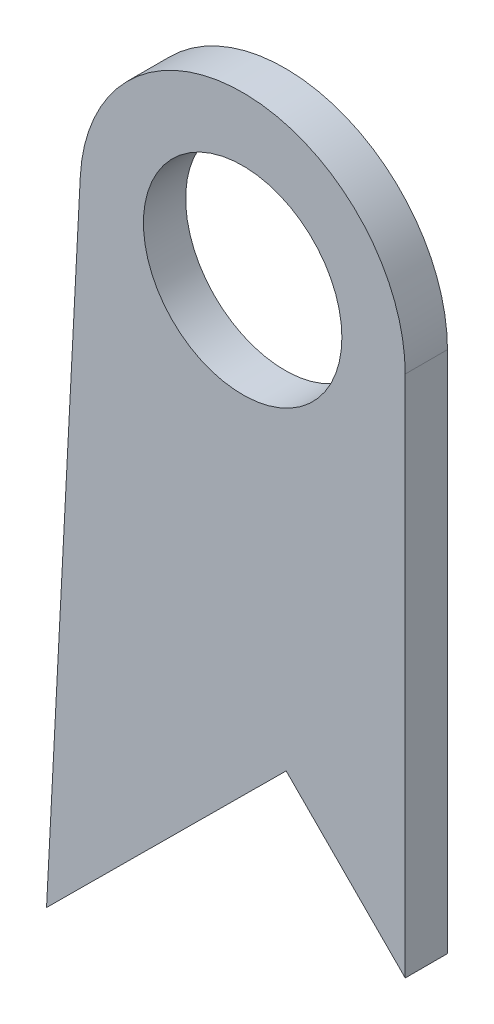
ISO-10303-21;
HEADER;
FILE_DESCRIPTION(('STEP AP214'),'2;1');
FILE_NAME('part.step','',(''),(''),'','','');
FILE_SCHEMA(('AUTOMOTIVE_DESIGN { 1 0 10303 214 1 1 1 1 }'));
ENDSEC;
DATA;
#1=APPLICATION_CONTEXT('core data for automotive mechanical design processes');
#2=APPLICATION_PROTOCOL_DEFINITION('international standard','automotive_design',2000,#1);
#3=PRODUCT_CONTEXT('',#1,'mechanical');
#4=PRODUCT('Part','Part','',(#3));
#5=PRODUCT_RELATED_PRODUCT_CATEGORY('part','',(#4));
#6=PRODUCT_DEFINITION_FORMATION('','',#4);
#7=PRODUCT_DEFINITION_CONTEXT('part definition',#1,'design');
#8=PRODUCT_DEFINITION('design','',#6,#7);
#9=PRODUCT_DEFINITION_SHAPE('','',#8);
#10=(LENGTH_UNIT() NAMED_UNIT(*) SI_UNIT(.MILLI.,.METRE.));
#11=(NAMED_UNIT(*) PLANE_ANGLE_UNIT() SI_UNIT($,.RADIAN.));
#12=(NAMED_UNIT(*) SI_UNIT($,.STERADIAN.) SOLID_ANGLE_UNIT());
#13=UNCERTAINTY_MEASURE_WITH_UNIT(LENGTH_MEASURE(1.E-05),#10,'distance_accuracy_value','');
#14=(GEOMETRIC_REPRESENTATION_CONTEXT(3) GLOBAL_UNCERTAINTY_ASSIGNED_CONTEXT((#13)) GLOBAL_UNIT_ASSIGNED_CONTEXT((#10,
#11,#12)) REPRESENTATION_CONTEXT('',''));
#15=CARTESIAN_POINT('',(0.,0.,0.));
#16=DIRECTION('',(0.,0.,1.));
#17=DIRECTION('',(1.,0.,0.));
#18=AXIS2_PLACEMENT_3D('',#15,#16,#17);
#19=CARTESIAN_POINT('',(0.,0.,10.));
#20=DIRECTION('',(0.,0.,-1.));
#21=DIRECTION('',(-1.,0.,0.));
#22=AXIS2_PLACEMENT_3D('',#19,#20,#21);
#23=PLANE('',#22);
#24=CARTESIAN_POINT('',(0.,0.,10.));
#25=DIRECTION('',(0.,0.,1.));
#26=DIRECTION('',(-1.,0.,0.));
#27=AXIS2_PLACEMENT_3D('',#24,#25,#26);
#28=CIRCLE('',#27,38.5);
#29=CARTESIAN_POINT('',(38.5,0.,10.));
#30=VERTEX_POINT('',#29);
#31=CARTESIAN_POINT('',(-38.4481594783973,1.99725629895806,10.));
#32=VERTEX_POINT('',#31);
#33=EDGE_CURVE('E117',#30,#32,#28,.T.);
#34=ORIENTED_EDGE('',*,*,#33,.T.);
#35=DIRECTION('',(-0.0518767869859238,-0.998653492945385,0.));
#36=VECTOR('',#35,1.);
#37=CARTESIAN_POINT('',(-46.4416889370996,-151.882090875355,10.));
#38=LINE('',#37,#36);
#39=CARTESIAN_POINT('',(-46.4416889370996,-151.882090875355,10.));
#40=VERTEX_POINT('',#39);
#41=EDGE_CURVE('E84',#32,#40,#38,.T.);
#42=ORIENTED_EDGE('',*,*,#41,.T.);
#43=DIRECTION('',(0.709335709290211,0.704870804847068,0.));
#44=VECTOR('',#43,1.);
#45=CARTESIAN_POINT('',(10.3051678061173,-95.4924264875899,10.));
#46=LINE('',#45,#44);
#47=CARTESIAN_POINT('',(10.3051678061173,-95.4924264875899,10.));
#48=VERTEX_POINT('',#47);
#49=EDGE_CURVE('E88',#40,#48,#46,.T.);
#50=ORIENTED_EDGE('',*,*,#49,.T.);
#51=DIRECTION('',(0.704870804847067,-0.709335709290212,0.));
#52=VECTOR('',#51,1.);
#53=CARTESIAN_POINT('',(38.5,-123.865854859198,10.));
#54=LINE('',#53,#52);
#55=CARTESIAN_POINT('',(38.5,-123.865854859198,10.));
#56=VERTEX_POINT('',#55);
#57=EDGE_CURVE('E92',#48,#56,#54,.T.);
#58=ORIENTED_EDGE('',*,*,#57,.T.);
#59=DIRECTION('',(0.,1.,0.));
#60=VECTOR('',#59,1.);
#61=CARTESIAN_POINT('',(38.5,0.,10.));
#62=LINE('',#61,#60);
#63=EDGE_CURVE('E50',#56,#30,#62,.T.);
#64=ORIENTED_EDGE('',*,*,#63,.T.);
#65=EDGE_LOOP('',(#34,#42,#50,#58,#64));
#66=FACE_BOUND('',#65,.T.);
#67=CARTESIAN_POINT('',(0.,0.,10.));
#68=DIRECTION('',(0.,0.,1.));
#69=DIRECTION('',(1.,0.,0.));
#70=AXIS2_PLACEMENT_3D('',#67,#68,#69);
#71=CIRCLE('',#70,23.5);
#72=CARTESIAN_POINT('',(23.5,0.,10.));
#73=VERTEX_POINT('',#72);
#74=EDGE_CURVE('E112',#73,#73,#71,.T.);
#75=ORIENTED_EDGE('',*,*,#74,.F.);
#76=EDGE_LOOP('',(#75));
#77=FACE_BOUND('',#76,.T.);
#78=ADVANCED_FACE('F33',(#66,#77),#23,.F.);
#79=CARTESIAN_POINT('',(0.,0.,0.));
#80=DIRECTION('',(0.,0.,-1.));
#81=DIRECTION('',(-1.,0.,0.));
#82=AXIS2_PLACEMENT_3D('',#79,#80,#81);
#83=PLANE('',#82);
#84=CARTESIAN_POINT('',(0.,0.,0.));
#85=DIRECTION('',(0.,0.,1.));
#86=DIRECTION('',(-1.,0.,0.));
#87=AXIS2_PLACEMENT_3D('',#84,#85,#86);
#88=CIRCLE('',#87,38.5);
#89=CARTESIAN_POINT('',(38.5,0.,0.));
#90=VERTEX_POINT('',#89);
#91=CARTESIAN_POINT('',(-38.4481594783973,1.99725629895806,0.));
#92=VERTEX_POINT('',#91);
#93=EDGE_CURVE('E108',#90,#92,#88,.T.);
#94=ORIENTED_EDGE('',*,*,#93,.F.);
#95=DIRECTION('',(0.,1.,0.));
#96=VECTOR('',#95,1.);
#97=CARTESIAN_POINT('',(38.5,0.,0.));
#98=LINE('',#97,#96);
#99=CARTESIAN_POINT('',(38.5,-123.865854859198,0.));
#100=VERTEX_POINT('',#99);
#101=EDGE_CURVE('E76',#100,#90,#98,.T.);
#102=ORIENTED_EDGE('',*,*,#101,.F.);
#103=DIRECTION('',(0.704870804847067,-0.709335709290212,0.));
#104=VECTOR('',#103,1.);
#105=CARTESIAN_POINT('',(38.5,-123.865854859198,0.));
#106=LINE('',#105,#104);
#107=CARTESIAN_POINT('',(10.3051678061173,-95.4924264875899,0.));
#108=VERTEX_POINT('',#107);
#109=EDGE_CURVE('E70',#108,#100,#106,.T.);
#110=ORIENTED_EDGE('',*,*,#109,.F.);
#111=DIRECTION('',(0.709335709290211,0.704870804847068,0.));
#112=VECTOR('',#111,1.);
#113=CARTESIAN_POINT('',(10.3051678061173,-95.4924264875899,0.));
#114=LINE('',#113,#112);
#115=CARTESIAN_POINT('',(-46.4416889370996,-151.882090875355,0.));
#116=VERTEX_POINT('',#115);
#117=EDGE_CURVE('E99',#116,#108,#114,.T.);
#118=ORIENTED_EDGE('',*,*,#117,.F.);
#119=DIRECTION('',(-0.0518767869859238,-0.998653492945385,0.));
#120=VECTOR('',#119,1.);
#121=CARTESIAN_POINT('',(-46.4416889370996,-151.882090875355,0.));
#122=LINE('',#121,#120);
#123=EDGE_CURVE('E111',#92,#116,#122,.T.);
#124=ORIENTED_EDGE('',*,*,#123,.F.);
#125=EDGE_LOOP('',(#94,#102,#110,#118,#124));
#126=FACE_BOUND('',#125,.T.);
#127=CARTESIAN_POINT('',(0.,0.,0.));
#128=DIRECTION('',(0.,0.,1.));
#129=DIRECTION('',(1.,0.,0.));
#130=AXIS2_PLACEMENT_3D('',#127,#128,#129);
#131=CIRCLE('',#130,23.5);
#132=CARTESIAN_POINT('',(23.5,0.,0.));
#133=VERTEX_POINT('',#132);
#134=EDGE_CURVE('E197',#133,#133,#131,.T.);
#135=ORIENTED_EDGE('',*,*,#134,.T.);
#136=EDGE_LOOP('',(#135));
#137=FACE_BOUND('',#136,.T.);
#138=ADVANCED_FACE('F121',(#126,#137),#83,.T.);
#139=CARTESIAN_POINT('',(0.,0.,10.));
#140=DIRECTION('',(0.,0.,-1.));
#141=DIRECTION('',(-1.,0.,0.));
#142=AXIS2_PLACEMENT_3D('',#139,#140,#141);
#143=CYLINDRICAL_SURFACE('',#142,38.5);
#144=ORIENTED_EDGE('',*,*,#93,.T.);
#145=DIRECTION('',(0.,0.,-1.));
#146=VECTOR('',#145,1.);
#147=CARTESIAN_POINT('',(-38.4481594783973,1.99725629895806,10.));
#148=LINE('',#147,#146);
#149=EDGE_CURVE('E11',#32,#92,#148,.T.);
#150=ORIENTED_EDGE('',*,*,#149,.F.);
#151=ORIENTED_EDGE('',*,*,#33,.F.);
#152=DIRECTION('',(0.,0.,-1.));
#153=VECTOR('',#152,1.);
#154=CARTESIAN_POINT('',(38.5,0.,10.));
#155=LINE('',#154,#153);
#156=EDGE_CURVE('E104',#30,#90,#155,.T.);
#157=ORIENTED_EDGE('',*,*,#156,.T.);
#158=EDGE_LOOP('',(#144,#150,#151,#157));
#159=FACE_BOUND('',#158,.T.);
#160=ADVANCED_FACE('F35',(#159),#143,.T.);
#161=CARTESIAN_POINT('',(-46.4416889370996,-151.882090875355,10.));
#162=DIRECTION('',(0.998653492945385,-0.0518767869859238,0.));
#163=DIRECTION('',(0.0518767869859238,0.998653492945385,0.));
#164=AXIS2_PLACEMENT_3D('',#161,#162,#163);
#165=PLANE('',#164);
#166=ORIENTED_EDGE('',*,*,#123,.T.);
#167=DIRECTION('',(0.,0.,-1.));
#168=VECTOR('',#167,1.);
#169=CARTESIAN_POINT('',(-46.4416889370996,-151.882090875355,10.));
#170=LINE('',#169,#168);
#171=EDGE_CURVE('E42',#40,#116,#170,.T.);
#172=ORIENTED_EDGE('',*,*,#171,.F.);
#173=ORIENTED_EDGE('',*,*,#41,.F.);
#174=ORIENTED_EDGE('',*,*,#149,.T.);
#175=EDGE_LOOP('',(#166,#172,#173,#174));
#176=FACE_BOUND('',#175,.T.);
#177=ADVANCED_FACE('F146',(#176),#165,.F.);
#178=CARTESIAN_POINT('',(10.3051678061173,-95.4924264875899,10.));
#179=DIRECTION('',(-0.704870804847068,0.709335709290211,0.));
#180=DIRECTION('',(-0.709335709290211,-0.704870804847068,0.));
#181=AXIS2_PLACEMENT_3D('',#178,#179,#180);
#182=PLANE('',#181);
#183=ORIENTED_EDGE('',*,*,#117,.T.);
#184=DIRECTION('',(0.,0.,-1.));
#185=VECTOR('',#184,1.);
#186=CARTESIAN_POINT('',(10.3051678061173,-95.4924264875899,10.));
#187=LINE('',#186,#185);
#188=EDGE_CURVE('E96',#48,#108,#187,.T.);
#189=ORIENTED_EDGE('',*,*,#188,.F.);
#190=ORIENTED_EDGE('',*,*,#49,.F.);
#191=ORIENTED_EDGE('',*,*,#171,.T.);
#192=EDGE_LOOP('',(#183,#189,#190,#191));
#193=FACE_BOUND('',#192,.T.);
#194=ADVANCED_FACE('F97',(#193),#182,.F.);
#195=CARTESIAN_POINT('',(38.5,-123.865854859198,10.));
#196=DIRECTION('',(0.709335709290212,0.704870804847067,0.));
#197=DIRECTION('',(-0.704870804847067,0.709335709290212,0.));
#198=AXIS2_PLACEMENT_3D('',#195,#196,#197);
#199=PLANE('',#198);
#200=ORIENTED_EDGE('',*,*,#109,.T.);
#201=DIRECTION('',(0.,0.,-1.));
#202=VECTOR('',#201,1.);
#203=CARTESIAN_POINT('',(38.5,-123.865854859198,10.));
#204=LINE('',#203,#202);
#205=EDGE_CURVE('E100',#56,#100,#204,.T.);
#206=ORIENTED_EDGE('',*,*,#205,.F.);
#207=ORIENTED_EDGE('',*,*,#57,.F.);
#208=ORIENTED_EDGE('',*,*,#188,.T.);
#209=EDGE_LOOP('',(#200,#206,#207,#208));
#210=FACE_BOUND('',#209,.T.);
#211=ADVANCED_FACE('F102',(#210),#199,.F.);
#212=CARTESIAN_POINT('',(38.5,0.,10.));
#213=DIRECTION('',(-1.,0.,0.));
#214=DIRECTION('',(0.,-1.,0.));
#215=AXIS2_PLACEMENT_3D('',#212,#213,#214);
#216=PLANE('',#215);
#217=ORIENTED_EDGE('',*,*,#101,.T.);
#218=ORIENTED_EDGE('',*,*,#156,.F.);
#219=ORIENTED_EDGE('',*,*,#63,.F.);
#220=ORIENTED_EDGE('',*,*,#205,.T.);
#221=EDGE_LOOP('',(#217,#218,#219,#220));
#222=FACE_BOUND('',#221,.T.);
#223=ADVANCED_FACE('F126',(#222),#216,.F.);
#224=CARTESIAN_POINT('',(0.,0.,10.));
#225=DIRECTION('',(0.,0.,-1.));
#226=DIRECTION('',(-1.,0.,0.));
#227=AXIS2_PLACEMENT_3D('',#224,#225,#226);
#228=CYLINDRICAL_SURFACE('',#227,23.5);
#229=ORIENTED_EDGE('',*,*,#74,.T.);
#230=EDGE_LOOP('',(#229));
#231=FACE_BOUND('',#230,.T.);
#232=ORIENTED_EDGE('',*,*,#134,.F.);
#233=EDGE_LOOP('',(#232));
#234=FACE_BOUND('',#233,.T.);
#235=ADVANCED_FACE('F128',(#231,#234),#228,.F.);
#236=CLOSED_SHELL('',(#78,#138,#160,#177,#194,#211,#223,#235));
#237=MANIFOLD_SOLID_BREP('B2',#236);
#238=ADVANCED_BREP_SHAPE_REPRESENTATION('',(#18,#237),#14);
#239=SHAPE_DEFINITION_REPRESENTATION(#9,#238);
ENDSEC;
END-ISO-10303-21;
